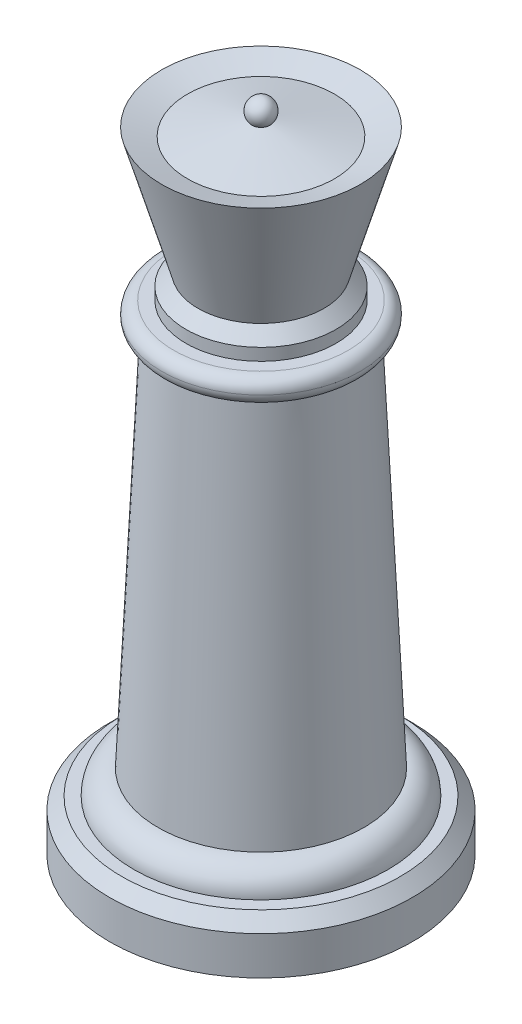
ISO-10303-21;
HEADER;
FILE_DESCRIPTION(('STEP AP214'),'2;1');
FILE_NAME('part.step','',(''),(''),'','','');
FILE_SCHEMA(('AUTOMOTIVE_DESIGN { 1 0 10303 214 1 1 1 1 }'));
ENDSEC;
DATA;
#1=APPLICATION_CONTEXT('core data for automotive mechanical design processes');
#2=APPLICATION_PROTOCOL_DEFINITION('international standard','automotive_design',2000,#1);
#3=PRODUCT_CONTEXT('',#1,'mechanical');
#4=PRODUCT('Part','Part','',(#3));
#5=PRODUCT_RELATED_PRODUCT_CATEGORY('part','',(#4));
#6=PRODUCT_DEFINITION_FORMATION('','',#4);
#7=PRODUCT_DEFINITION_CONTEXT('part definition',#1,'design');
#8=PRODUCT_DEFINITION('design','',#6,#7);
#9=PRODUCT_DEFINITION_SHAPE('','',#8);
#10=(LENGTH_UNIT() NAMED_UNIT(*) SI_UNIT(.MILLI.,.METRE.));
#11=(NAMED_UNIT(*) PLANE_ANGLE_UNIT() SI_UNIT($,.RADIAN.));
#12=(NAMED_UNIT(*) SI_UNIT($,.STERADIAN.) SOLID_ANGLE_UNIT());
#13=UNCERTAINTY_MEASURE_WITH_UNIT(LENGTH_MEASURE(1.E-05),#10,'distance_accuracy_value','');
#14=(GEOMETRIC_REPRESENTATION_CONTEXT(3) GLOBAL_UNCERTAINTY_ASSIGNED_CONTEXT((#13)) GLOBAL_UNIT_ASSIGNED_CONTEXT((#10,
#11,#12)) REPRESENTATION_CONTEXT('',''));
#15=CARTESIAN_POINT('',(0.,0.,0.));
#16=DIRECTION('',(0.,0.,1.));
#17=DIRECTION('',(1.,0.,0.));
#18=AXIS2_PLACEMENT_3D('',#15,#16,#17);
#19=CARTESIAN_POINT('',(0.,29.5155959411196,0.));
#20=DIRECTION('',(0.,-1.,0.));
#21=DIRECTION('',(1.,0.,0.));
#22=AXIS2_PLACEMENT_3D('',#19,#20,#21);
#23=SPHERICAL_SURFACE('',#22,0.900000000000003);
#24=CARTESIAN_POINT('',(0.,28.9177423138337,0.));
#25=DIRECTION('',(0.,-1.,0.));
#26=DIRECTION('',(0.,0.,-1.));
#27=AXIS2_PLACEMENT_3D('',#24,#25,#26);
#28=CIRCLE('',#27,0.672734004151016);
#29=CARTESIAN_POINT('',(0.,28.9177423138337,-0.672734004151008));
#30=VERTEX_POINT('',#29);
#31=EDGE_CURVE('E66',#30,#30,#28,.T.);
#32=ORIENTED_EDGE('',*,*,#31,.F.);
#33=EDGE_LOOP('',(#32));
#34=FACE_BOUND('',#33,.T.);
#35=ADVANCED_FACE('F43',(#34),#23,.T.);
#36=CARTESIAN_POINT('',(0.,28.9177423138337,0.));
#37=DIRECTION('',(0.,-1.,0.));
#38=DIRECTION('',(0.,0.,-1.));
#39=AXIS2_PLACEMENT_3D('',#36,#37,#38);
#40=CONICAL_SURFACE('',#39,0.672734004151016,1.35445566542161);
#41=CARTESIAN_POINT('',(0.,27.8655959411196,0.));
#42=DIRECTION('',(0.,-1.,0.));
#43=DIRECTION('',(0.,0.,-1.));
#44=AXIS2_PLACEMENT_3D('',#41,#42,#43);
#45=CIRCLE('',#44,5.46);
#46=CARTESIAN_POINT('',(0.,27.8655959411196,-5.46));
#47=VERTEX_POINT('',#46);
#48=EDGE_CURVE('E69',#47,#47,#45,.T.);
#49=CARTESIAN_POINT('',(0.,27.8655959411196,-5.46));
#50=CARTESIAN_POINT('',(0.,27.8765557991687,-5.41013264587657));
#51=CARTESIAN_POINT('',(0.,27.8875156572178,-5.36026529175314));
#52=CARTESIAN_POINT('',(0.,27.909435373316,-5.26053058350629));
#53=CARTESIAN_POINT('',(0.,27.9203952313651,-5.21066322938286));
#54=CARTESIAN_POINT('',(0.,27.9423149474633,-5.11092852113601));
#55=CARTESIAN_POINT('',(0.,27.9532748055124,-5.06106116701258));
#56=CARTESIAN_POINT('',(0.,27.9751945216106,-4.96132645876573));
#57=CARTESIAN_POINT('',(0.,27.9861543796598,-4.9114591046423));
#58=CARTESIAN_POINT('',(0.,28.008074095758,-4.81172439639545));
#59=CARTESIAN_POINT('',(0.,28.0190339538071,-4.76185704227202));
#60=CARTESIAN_POINT('',(0.,28.0409536699053,-4.66212233402516));
#61=CARTESIAN_POINT('',(0.,28.0519135279544,-4.61225497990174));
#62=CARTESIAN_POINT('',(0.,28.0738332440526,-4.51252027165488));
#63=CARTESIAN_POINT('',(0.,28.0847931021017,-4.46265291753146));
#64=CARTESIAN_POINT('',(0.,28.1067128181999,-4.3629182092846));
#65=CARTESIAN_POINT('',(0.,28.117672676249,-4.31305085516118));
#66=CARTESIAN_POINT('',(0.,28.1395923923472,-4.21331614691432));
#67=CARTESIAN_POINT('',(0.,28.1505522503963,-4.16344879279089));
#68=CARTESIAN_POINT('',(0.,28.1724719664945,-4.06371408454404));
#69=CARTESIAN_POINT('',(0.,28.1834318245436,-4.01384673042061));
#70=CARTESIAN_POINT('',(0.,28.2053515406418,-3.91411202217376));
#71=CARTESIAN_POINT('',(0.,28.2163113986909,-3.86424466805033));
#72=CARTESIAN_POINT('',(0.,28.2382311147892,-3.76450995980348));
#73=CARTESIAN_POINT('',(0.,28.2491909728383,-3.71464260568005));
#74=CARTESIAN_POINT('',(0.,28.2711106889365,-3.6149078974332));
#75=CARTESIAN_POINT('',(0.,28.2820705469856,-3.56504054330977));
#76=CARTESIAN_POINT('',(0.,28.3039902630838,-3.46530583506292));
#77=CARTESIAN_POINT('',(0.,28.3149501211329,-3.41543848093949));
#78=CARTESIAN_POINT('',(0.,28.3368698372311,-3.31570377269264));
#79=CARTESIAN_POINT('',(0.,28.3478296952802,-3.26583641856921));
#80=CARTESIAN_POINT('',(0.,28.3697494113784,-3.16610171032236));
#81=CARTESIAN_POINT('',(0.,28.3807092694275,-3.11623435619893));
#82=CARTESIAN_POINT('',(0.,28.4026289855257,-3.01649964795207));
#83=CARTESIAN_POINT('',(0.,28.4135888435748,-2.96663229382865));
#84=CARTESIAN_POINT('',(0.,28.435508559673,-2.86689758558179));
#85=CARTESIAN_POINT('',(0.,28.4464684177221,-2.81703023145837));
#86=CARTESIAN_POINT('',(0.,28.4683881338204,-2.71729552321151));
#87=CARTESIAN_POINT('',(0.,28.4793479918695,-2.66742816908809));
#88=CARTESIAN_POINT('',(0.,28.5012677079677,-2.56769346084123));
#89=CARTESIAN_POINT('',(0.,28.5122275660168,-2.51782610671781));
#90=CARTESIAN_POINT('',(0.,28.534147282115,-2.41809139847095));
#91=CARTESIAN_POINT('',(0.,28.5451071401641,-2.36822404434752));
#92=CARTESIAN_POINT('',(0.,28.5670268562623,-2.26848933610067));
#93=CARTESIAN_POINT('',(0.,28.5779867143114,-2.21862198197724));
#94=CARTESIAN_POINT('',(0.,28.5999064304096,-2.11888727373039));
#95=CARTESIAN_POINT('',(0.,28.6108662884587,-2.06901991960696));
#96=CARTESIAN_POINT('',(0.,28.6327860045569,-1.96928521136011));
#97=CARTESIAN_POINT('',(0.,28.643745862606,-1.91941785723668));
#98=CARTESIAN_POINT('',(0.,28.6656655787042,-1.81968314898983));
#99=CARTESIAN_POINT('',(0.,28.6766254367533,-1.7698157948664));
#100=CARTESIAN_POINT('',(0.,28.6985451528516,-1.67008108661955));
#101=CARTESIAN_POINT('',(0.,28.7095050109007,-1.62021373249612));
#102=CARTESIAN_POINT('',(0.,28.7314247269989,-1.52047902424927));
#103=CARTESIAN_POINT('',(0.,28.742384585048,-1.47061167012584));
#104=CARTESIAN_POINT('',(0.,28.7643043011462,-1.37087696187899));
#105=CARTESIAN_POINT('',(0.,28.7752641591953,-1.32100960775556));
#106=CARTESIAN_POINT('',(0.,28.7971838752935,-1.2212748995087));
#107=CARTESIAN_POINT('',(0.,28.8081437333426,-1.17140754538528));
#108=CARTESIAN_POINT('',(0.,28.8300634494408,-1.07167283713842));
#109=CARTESIAN_POINT('',(0.,28.8410233074899,-1.021805483015));
#110=CARTESIAN_POINT('',(0.,28.8629430235881,-0.922070774768142));
#111=CARTESIAN_POINT('',(0.,28.8739028816372,-0.872203420644716));
#112=CARTESIAN_POINT('',(0.,28.8958225977354,-0.772468712397862));
#113=CARTESIAN_POINT('',(0.,28.9067824557846,-0.722601358274435));
#114=CARTESIAN_POINT('',(0.,28.9177423138337,-0.672734004151008));
#115=B_SPLINE_CURVE_WITH_KNOTS('',3,(#49,#50,#51,#52,#53,#54,#55,#56,#57,#58,#59,#60,#61,#62,
#63,#64,#65,#66,#67,#68,#69,#70,#71,#72,#73,#74,#75,#76,#77,#78,#79,#80,#81,#82,#83,#84,#85,#86,
#87,#88,#89,#90,#91,#92,#93,#94,#95,#96,#97,#98,#99,#100,#101,#102,#103,#104,#105,#106,#107,
#108,#109,#110,#111,#112,#113,#114),.UNSPECIFIED.,.F.,.F.,(4,2,2,2,2,2,2,2,2,2,2,2,2,2,2,2,2,2,
2,2,2,2,2,2,2,2,2,2,2,2,2,2,4),(0.,0.153172593702496,0.306345187404993,0.45951778110749,
0.612690374809987,0.765862968512483,0.91903556221498,1.07220815591748,1.22538074961997,
1.37855334332247,1.53172593702497,1.68489853072746,1.83807112442996,1.99124371813246,
2.14441631183495,2.29758890553745,2.45076149923995,2.60393409294244,2.75710668664494,
2.91027928034744,3.06345187404993,3.21662446775243,3.36979706145493,3.52296965515742,
3.67614224885992,3.82931484256242,3.98248743626492,4.13566002996741,4.28883262366991,
4.44200521737241,4.5951778110749,4.7483504047774,4.9015229984799),.UNSPECIFIED.);
#116=EDGE_CURVE('BSEAM111',#47,#30,#115,.T.);
#117=ORIENTED_EDGE('',*,*,#48,.F.);
#118=ORIENTED_EDGE('',*,*,#31,.T.);
#119=ORIENTED_EDGE('',*,*,#116,.T.);
#120=ORIENTED_EDGE('',*,*,#116,.F.);
#121=EDGE_LOOP('',(#117,#119,#118,#120));
#122=FACE_BOUND('',#121,.T.);
#123=ADVANCED_FACE('F111',(#122),#40,.T.);
#124=CARTESIAN_POINT('',(0.,27.8655959411196,0.));
#125=DIRECTION('',(0.,1.,0.));
#126=DIRECTION('',(0.,0.,1.));
#127=AXIS2_PLACEMENT_3D('',#124,#125,#126);
#128=CONICAL_SURFACE('',#127,5.46,1.26791145841993);
#129=CARTESIAN_POINT('',(0.,28.4655959411196,0.));
#130=DIRECTION('',(0.,-1.,0.));
#131=DIRECTION('',(0.,0.,-1.));
#132=AXIS2_PLACEMENT_3D('',#129,#130,#131);
#133=CIRCLE('',#132,7.38);
#134=CARTESIAN_POINT('',(0.,28.4655959411196,-7.38));
#135=VERTEX_POINT('',#134);
#136=EDGE_CURVE('E72',#135,#135,#133,.T.);
#137=ORIENTED_EDGE('',*,*,#136,.F.);
#138=EDGE_LOOP('',(#137));
#139=FACE_BOUND('',#138,.T.);
#140=ORIENTED_EDGE('',*,*,#48,.T.);
#141=EDGE_LOOP('',(#140));
#142=FACE_BOUND('',#141,.T.);
#143=ADVANCED_FACE('F117',(#139,#142),#128,.F.);
#144=CARTESIAN_POINT('',(0.,28.4655959411196,0.));
#145=DIRECTION('',(0.,1.,0.));
#146=DIRECTION('',(0.,0.,1.));
#147=AXIS2_PLACEMENT_3D('',#144,#145,#146);
#148=CONICAL_SURFACE('',#147,7.38,0.281693791071137);
#149=CARTESIAN_POINT('',(0.,19.1355959411196,0.));
#150=DIRECTION('',(0.,-1.,0.));
#151=DIRECTION('',(0.,0.,-1.));
#152=AXIS2_PLACEMENT_3D('',#149,#150,#151);
#153=CIRCLE('',#152,4.68);
#154=CARTESIAN_POINT('',(0.,19.1355959411196,-4.68));
#155=VERTEX_POINT('',#154);
#156=EDGE_CURVE('E75',#155,#155,#153,.T.);
#157=ORIENTED_EDGE('',*,*,#156,.F.);
#158=EDGE_LOOP('',(#157));
#159=FACE_BOUND('',#158,.T.);
#160=ORIENTED_EDGE('',*,*,#136,.T.);
#161=EDGE_LOOP('',(#160));
#162=FACE_BOUND('',#161,.T.);
#163=ADVANCED_FACE('F163',(#159,#162),#148,.T.);
#164=CARTESIAN_POINT('',(0.,-18.3344040588804,0.));
#165=DIRECTION('',(0.,-1.,0.));
#166=DIRECTION('',(0.,0.,-1.));
#167=AXIS2_PLACEMENT_3D('',#164,#165,#166);
#168=CYLINDRICAL_SURFACE('',#167,5.58);
#169=CARTESIAN_POINT('',(0.,18.2355959411196,0.));
#170=DIRECTION('',(0.,-1.,0.));
#171=DIRECTION('',(0.,0.,-1.));
#172=AXIS2_PLACEMENT_3D('',#169,#170,#171);
#173=CIRCLE('',#172,5.58);
#174=CARTESIAN_POINT('',(0.,18.2355959411196,-5.58));
#175=VERTEX_POINT('',#174);
#176=EDGE_CURVE('E63',#175,#175,#173,.T.);
#177=ORIENTED_EDGE('',*,*,#176,.T.);
#178=EDGE_LOOP('',(#177));
#179=FACE_BOUND('',#178,.T.);
#180=CARTESIAN_POINT('',(0.,17.3355959411196,0.));
#181=DIRECTION('',(0.,-1.,0.));
#182=DIRECTION('',(0.,0.,-1.));
#183=AXIS2_PLACEMENT_3D('',#180,#181,#182);
#184=CIRCLE('',#183,5.58);
#185=CARTESIAN_POINT('',(0.,17.3355959411196,-5.58));
#186=VERTEX_POINT('',#185);
#187=EDGE_CURVE('E78',#186,#186,#184,.T.);
#188=ORIENTED_EDGE('',*,*,#187,.F.);
#189=EDGE_LOOP('',(#188));
#190=FACE_BOUND('',#189,.T.);
#191=ADVANCED_FACE('F159',(#179,#190),#168,.T.);
#192=CARTESIAN_POINT('',(-5.58,17.3355959411196,0.));
#193=DIRECTION('',(0.,-1.,0.));
#194=DIRECTION('',(0.,0.,-1.));
#195=AXIS2_PLACEMENT_3D('',#192,#193,#194);
#196=PLANE('',#195);
#197=CARTESIAN_POINT('',(0.,17.3355959411196,0.));
#198=DIRECTION('',(0.,-1.,0.));
#199=DIRECTION('',(0.,0.,-1.));
#200=AXIS2_PLACEMENT_3D('',#197,#198,#199);
#201=CIRCLE('',#200,6.48);
#202=CARTESIAN_POINT('',(0.,17.3355959411196,-6.48));
#203=VERTEX_POINT('',#202);
#204=EDGE_CURVE('E51',#203,#203,#201,.F.);
#205=ORIENTED_EDGE('',*,*,#204,.T.);
#206=EDGE_LOOP('',(#205));
#207=FACE_BOUND('',#206,.T.);
#208=ORIENTED_EDGE('',*,*,#187,.T.);
#209=EDGE_LOOP('',(#208));
#210=FACE_BOUND('',#209,.T.);
#211=ADVANCED_FACE('F156',(#207,#210),#196,.F.);
#212=CARTESIAN_POINT('',(-6.36,15.5355959411196,0.));
#213=DIRECTION('',(0.,1.,0.));
#214=DIRECTION('',(0.,0.,1.));
#215=AXIS2_PLACEMENT_3D('',#212,#213,#214);
#216=PLANE('',#215);
#217=CARTESIAN_POINT('',(0.,15.5355959411196,0.));
#218=DIRECTION('',(0.,1.,0.));
#219=DIRECTION('',(0.,0.,1.));
#220=AXIS2_PLACEMENT_3D('',#217,#218,#219);
#221=CIRCLE('',#220,6.48);
#222=CARTESIAN_POINT('',(0.,15.5355959411196,6.48));
#223=VERTEX_POINT('',#222);
#224=EDGE_CURVE('E10',#223,#223,#221,.F.);
#225=ORIENTED_EDGE('',*,*,#224,.T.);
#226=EDGE_LOOP('',(#225));
#227=FACE_BOUND('',#226,.T.);
#228=CARTESIAN_POINT('',(0.,15.5355959411196,0.));
#229=DIRECTION('',(0.,-1.,0.));
#230=DIRECTION('',(0.,0.,-1.));
#231=AXIS2_PLACEMENT_3D('',#228,#229,#230);
#232=CIRCLE('',#231,6.36);
#233=CARTESIAN_POINT('',(0.,15.5355959411196,-6.36));
#234=VERTEX_POINT('',#233);
#235=EDGE_CURVE('E81',#234,#234,#232,.T.);
#236=ORIENTED_EDGE('',*,*,#235,.F.);
#237=EDGE_LOOP('',(#236));
#238=FACE_BOUND('',#237,.T.);
#239=ADVANCED_FACE('F152',(#227,#238),#216,.F.);
#240=CARTESIAN_POINT('',(0.,15.5355959411196,0.));
#241=DIRECTION('',(0.,-1.,0.));
#242=DIRECTION('',(0.,0.,-1.));
#243=AXIS2_PLACEMENT_3D('',#240,#241,#242);
#244=CONICAL_SURFACE('',#243,6.36,0.0455193824437212);
#245=CARTESIAN_POINT('',(0.,-12.7844040588804,0.));
#246=DIRECTION('',(0.,-1.,0.));
#247=DIRECTION('',(0.,0.,-1.));
#248=AXIS2_PLACEMENT_3D('',#245,#246,#247);
#249=CIRCLE('',#248,7.65);
#250=CARTESIAN_POINT('',(0.,-12.7844040588804,-7.65));
#251=VERTEX_POINT('',#250);
#252=EDGE_CURVE('E84',#251,#251,#249,.T.);
#253=ORIENTED_EDGE('',*,*,#252,.F.);
#254=EDGE_LOOP('',(#253));
#255=FACE_BOUND('',#254,.T.);
#256=ORIENTED_EDGE('',*,*,#235,.T.);
#257=EDGE_LOOP('',(#256));
#258=FACE_BOUND('',#257,.T.);
#259=ADVANCED_FACE('F146',(#255,#258),#244,.T.);
#260=CARTESIAN_POINT('',(-9.45,-14.5844040588804,0.));
#261=DIRECTION('',(0.,-1.,0.));
#262=DIRECTION('',(0.,0.,-1.));
#263=AXIS2_PLACEMENT_3D('',#260,#261,#262);
#264=PLANE('',#263);
#265=CARTESIAN_POINT('',(0.,-14.5844040588804,0.));
#266=DIRECTION('',(0.,-1.,0.));
#267=DIRECTION('',(0.,0.,-1.));
#268=AXIS2_PLACEMENT_3D('',#265,#266,#267);
#269=CIRCLE('',#268,10.35);
#270=CARTESIAN_POINT('',(0.,-14.5844040588804,-10.35));
#271=VERTEX_POINT('',#270);
#272=EDGE_CURVE('E55',#271,#271,#269,.F.);
#273=ORIENTED_EDGE('',*,*,#272,.T.);
#274=EDGE_LOOP('',(#273));
#275=FACE_BOUND('',#274,.T.);
#276=CARTESIAN_POINT('',(0.,-14.5844040588804,0.));
#277=DIRECTION('',(0.,-1.,0.));
#278=DIRECTION('',(0.,0.,-1.));
#279=AXIS2_PLACEMENT_3D('',#276,#277,#278);
#280=CIRCLE('',#279,9.45);
#281=CARTESIAN_POINT('',(0.,-14.5844040588804,-9.45));
#282=VERTEX_POINT('',#281);
#283=EDGE_CURVE('E87',#282,#282,#280,.T.);
#284=ORIENTED_EDGE('',*,*,#283,.T.);
#285=EDGE_LOOP('',(#284));
#286=FACE_BOUND('',#285,.T.);
#287=ADVANCED_FACE('F139',(#275,#286),#264,.F.);
#288=CARTESIAN_POINT('',(0.,-18.3344040588804,0.));
#289=DIRECTION('',(0.,-1.,0.));
#290=DIRECTION('',(0.,0.,-1.));
#291=AXIS2_PLACEMENT_3D('',#288,#289,#290);
#292=CYLINDRICAL_SURFACE('',#291,11.25);
#293=CARTESIAN_POINT('',(0.,-15.4844040588804,0.));
#294=DIRECTION('',(0.,-1.,0.));
#295=DIRECTION('',(0.,0.,-1.));
#296=AXIS2_PLACEMENT_3D('',#293,#294,#295);
#297=CIRCLE('',#296,11.25);
#298=CARTESIAN_POINT('',(0.,-15.4844040588804,-11.25));
#299=VERTEX_POINT('',#298);
#300=EDGE_CURVE('E60',#299,#299,#297,.T.);
#301=ORIENTED_EDGE('',*,*,#300,.T.);
#302=EDGE_LOOP('',(#301));
#303=FACE_BOUND('',#302,.T.);
#304=CARTESIAN_POINT('',(0.,-18.3344040588804,0.));
#305=DIRECTION('',(0.,-1.,0.));
#306=DIRECTION('',(0.,0.,-1.));
#307=AXIS2_PLACEMENT_3D('',#304,#305,#306);
#308=CIRCLE('',#307,11.25);
#309=CARTESIAN_POINT('',(0.,-18.3344040588804,-11.25));
#310=VERTEX_POINT('',#309);
#311=EDGE_CURVE('E90',#310,#310,#308,.T.);
#312=ORIENTED_EDGE('',*,*,#311,.F.);
#313=EDGE_LOOP('',(#312));
#314=FACE_BOUND('',#313,.T.);
#315=ADVANCED_FACE('F136',(#303,#314),#292,.T.);
#316=CARTESIAN_POINT('',(0.,-18.3344040588804,0.));
#317=DIRECTION('',(0.,1.,0.));
#318=DIRECTION('',(0.,0.,1.));
#319=AXIS2_PLACEMENT_3D('',#316,#317,#318);
#320=PLANE('',#319);
#321=ORIENTED_EDGE('',*,*,#311,.T.);
#322=EDGE_LOOP('',(#321));
#323=FACE_BOUND('',#322,.T.);
#324=ADVANCED_FACE('F126',(#323),#320,.F.);
#325=CARTESIAN_POINT('',(0.,18.2355959411196,0.));
#326=DIRECTION('',(0.,-1.,0.));
#327=DIRECTION('',(0.,0.,-1.));
#328=AXIS2_PLACEMENT_3D('',#325,#326,#327);
#329=CONICAL_SURFACE('',#328,5.58,0.78539816339745);
#330=ORIENTED_EDGE('',*,*,#156,.T.);
#331=EDGE_LOOP('',(#330));
#332=FACE_BOUND('',#331,.T.);
#333=ORIENTED_EDGE('',*,*,#176,.F.);
#334=EDGE_LOOP('',(#333));
#335=FACE_BOUND('',#334,.T.);
#336=ADVANCED_FACE('F123',(#332,#335),#329,.T.);
#337=CARTESIAN_POINT('',(0.,-15.4844040588804,0.));
#338=DIRECTION('',(0.,-1.,0.));
#339=DIRECTION('',(0.,0.,-1.));
#340=AXIS2_PLACEMENT_3D('',#337,#338,#339);
#341=CONICAL_SURFACE('',#340,11.25,0.78539816339745);
#342=ORIENTED_EDGE('',*,*,#272,.F.);
#343=EDGE_LOOP('',(#342));
#344=FACE_BOUND('',#343,.T.);
#345=ORIENTED_EDGE('',*,*,#300,.F.);
#346=EDGE_LOOP('',(#345));
#347=FACE_BOUND('',#346,.T.);
#348=ADVANCED_FACE('F107',(#344,#347),#341,.T.);
#349=CARTESIAN_POINT('',(0.,-14.5844040588804,0.));
#350=DIRECTION('',(0.,-1.,0.));
#351=DIRECTION('',(0.,0.,-1.));
#352=AXIS2_PLACEMENT_3D('',#349,#350,#351);
#353=TOROIDAL_SURFACE('',#352,7.65,1.8);
#354=ORIENTED_EDGE('',*,*,#252,.T.);
#355=EDGE_LOOP('',(#354));
#356=FACE_BOUND('',#355,.T.);
#357=ORIENTED_EDGE('',*,*,#283,.F.);
#358=EDGE_LOOP('',(#357));
#359=FACE_BOUND('',#358,.T.);
#360=ADVANCED_FACE('F100',(#356,#359),#353,.T.);
#361=CARTESIAN_POINT('',(0.,16.4355959411196,0.));
#362=DIRECTION('',(0.,1.,0.));
#363=DIRECTION('',(0.,0.,1.));
#364=AXIS2_PLACEMENT_3D('',#361,#362,#363);
#365=TOROIDAL_SURFACE('',#364,6.48,0.9);
#366=ORIENTED_EDGE('',*,*,#224,.F.);
#367=EDGE_LOOP('',(#366));
#368=FACE_BOUND('',#367,.T.);
#369=CARTESIAN_POINT('',(0.,16.4355959411196,0.));
#370=DIRECTION('',(0.,1.,0.));
#371=DIRECTION('',(0.,0.,1.));
#372=AXIS2_PLACEMENT_3D('',#369,#370,#371);
#373=CIRCLE('',#372,7.38);
#374=CARTESIAN_POINT('',(0.,16.4355959411196,7.38));
#375=VERTEX_POINT('',#374);
#376=EDGE_CURVE('E47',#375,#375,#373,.T.);
#377=ORIENTED_EDGE('',*,*,#376,.F.);
#378=EDGE_LOOP('',(#377));
#379=FACE_BOUND('',#378,.T.);
#380=ADVANCED_FACE('F45',(#368,#379),#365,.T.);
#381=CARTESIAN_POINT('',(0.,16.4355959411196,0.));
#382=DIRECTION('',(0.,-1.,0.));
#383=DIRECTION('',(0.,0.,-1.));
#384=AXIS2_PLACEMENT_3D('',#381,#382,#383);
#385=TOROIDAL_SURFACE('',#384,6.48,0.9);
#386=ORIENTED_EDGE('',*,*,#204,.F.);
#387=EDGE_LOOP('',(#386));
#388=FACE_BOUND('',#387,.T.);
#389=ORIENTED_EDGE('',*,*,#376,.T.);
#390=EDGE_LOOP('',(#389));
#391=FACE_BOUND('',#390,.T.);
#392=ADVANCED_FACE('F97',(#388,#391),#385,.T.);
#393=CLOSED_SHELL('',(#35,#123,#143,#163,#191,#211,#239,#259,#287,#315,#324,#336,#348,#360,#380,#392));
#394=MANIFOLD_SOLID_BREP('B2',#393);
#395=ADVANCED_BREP_SHAPE_REPRESENTATION('',(#18,#394),#14);
#396=SHAPE_DEFINITION_REPRESENTATION(#9,#395);
ENDSEC;
END-ISO-10303-21;
